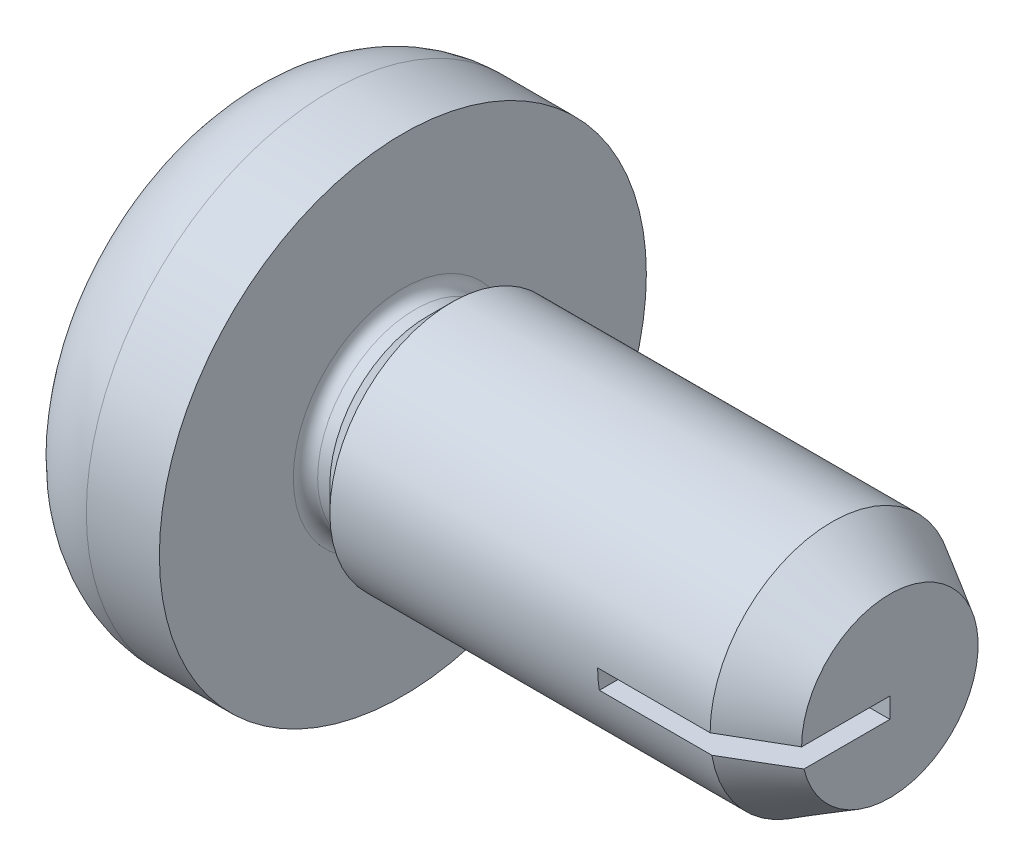
ISO-10303-21;
HEADER;
FILE_DESCRIPTION(('STEP AP214'),'2;1');
FILE_NAME('part.step','',(''),(''),'','','');
FILE_SCHEMA(('AUTOMOTIVE_DESIGN { 1 0 10303 214 1 1 1 1 }'));
ENDSEC;
DATA;
#1=APPLICATION_CONTEXT('core data for automotive mechanical design processes');
#2=APPLICATION_PROTOCOL_DEFINITION('international standard','automotive_design',2000,#1);
#3=PRODUCT_CONTEXT('',#1,'mechanical');
#4=PRODUCT('Part','Part','',(#3));
#5=PRODUCT_RELATED_PRODUCT_CATEGORY('part','',(#4));
#6=PRODUCT_DEFINITION_FORMATION('','',#4);
#7=PRODUCT_DEFINITION_CONTEXT('part definition',#1,'design');
#8=PRODUCT_DEFINITION('design','',#6,#7);
#9=PRODUCT_DEFINITION_SHAPE('','',#8);
#10=(LENGTH_UNIT() NAMED_UNIT(*) SI_UNIT(.MILLI.,.METRE.));
#11=(NAMED_UNIT(*) PLANE_ANGLE_UNIT() SI_UNIT($,.RADIAN.));
#12=(NAMED_UNIT(*) SI_UNIT($,.STERADIAN.) SOLID_ANGLE_UNIT());
#13=UNCERTAINTY_MEASURE_WITH_UNIT(LENGTH_MEASURE(1.E-05),#10,'distance_accuracy_value','');
#14=(GEOMETRIC_REPRESENTATION_CONTEXT(3) GLOBAL_UNCERTAINTY_ASSIGNED_CONTEXT((#13)) GLOBAL_UNIT_ASSIGNED_CONTEXT((#10,
#11,#12)) REPRESENTATION_CONTEXT('',''));
#15=CARTESIAN_POINT('',(0.,0.,0.));
#16=DIRECTION('',(0.,0.,1.));
#17=DIRECTION('',(1.,0.,0.));
#18=AXIS2_PLACEMENT_3D('',#15,#16,#17);
#19=CARTESIAN_POINT('',(0.,0.,0.));
#20=DIRECTION('',(-1.,0.,0.));
#21=DIRECTION('',(0.,0.,1.));
#22=AXIS2_PLACEMENT_3D('',#19,#20,#21);
#23=CYLINDRICAL_SURFACE('',#22,1.);
#24=CARTESIAN_POINT('',(1.8,0.,0.));
#25=DIRECTION('',(-1.,0.,0.));
#26=DIRECTION('',(0.,0.,1.));
#27=AXIS2_PLACEMENT_3D('',#24,#25,#26);
#28=CIRCLE('',#27,1.);
#29=CARTESIAN_POINT('',(1.8,0.,1.));
#30=VERTEX_POINT('',#29);
#31=EDGE_CURVE('E239',#30,#30,#28,.T.);
#32=ORIENTED_EDGE('',*,*,#31,.F.);
#33=EDGE_LOOP('',(#32));
#34=FACE_BOUND('',#33,.T.);
#35=DIRECTION('',(-1.,0.,0.));
#36=VECTOR('',#35,1.);
#37=CARTESIAN_POINT('',(0.,0.,1.));
#38=LINE('',#37,#36);
#39=CARTESIAN_POINT('',(4.92368602791855,0.,1.));
#40=VERTEX_POINT('',#39);
#41=CARTESIAN_POINT('',(4.,0.,1.));
#42=VERTEX_POINT('',#41);
#43=EDGE_CURVE('E385',#40,#42,#38,.T.);
#44=ORIENTED_EDGE('',*,*,#43,.F.);
#45=CARTESIAN_POINT('',(4.92368602791855,0.,0.));
#46=DIRECTION('',(-1.,0.,0.));
#47=DIRECTION('',(0.,0.,1.));
#48=AXIS2_PLACEMENT_3D('',#45,#46,#47);
#49=CIRCLE('',#48,1.);
#50=CARTESIAN_POINT('',(4.92368602791855,-0.166666666667,0.986013297183214));
#51=VERTEX_POINT('',#50);
#52=EDGE_CURVE('E378',#40,#51,#49,.T.);
#53=ORIENTED_EDGE('',*,*,#52,.T.);
#54=DIRECTION('',(-1.,0.,0.));
#55=VECTOR('',#54,1.);
#56=CARTESIAN_POINT('',(0.,-0.166666666667,0.986013297183214));
#57=LINE('',#56,#55);
#58=CARTESIAN_POINT('',(4.,-0.166666666667,0.986013297183214));
#59=VERTEX_POINT('',#58);
#60=EDGE_CURVE('E388',#59,#51,#57,.F.);
#61=ORIENTED_EDGE('',*,*,#60,.F.);
#62=CARTESIAN_POINT('',(4.,0.,0.));
#63=DIRECTION('',(1.,0.,0.));
#64=DIRECTION('',(0.,0.,-1.));
#65=AXIS2_PLACEMENT_3D('',#62,#63,#64);
#66=CIRCLE('',#65,1.);
#67=EDGE_CURVE('E47',#42,#59,#66,.T.);
#68=ORIENTED_EDGE('',*,*,#67,.F.);
#69=EDGE_LOOP('',(#44,#53,#61,#68));
#70=FACE_BOUND('',#69,.T.);
#71=ADVANCED_FACE('F77',(#34,#70),#23,.T.);
#72=CARTESIAN_POINT('',(4.92368602791855,0.,0.));
#73=DIRECTION('',(-1.,0.,0.));
#74=DIRECTION('',(0.,0.,1.));
#75=AXIS2_PLACEMENT_3D('',#72,#73,#74);
#76=CONICAL_SURFACE('',#75,1.,0.52359877559829);
#77=ORIENTED_EDGE('',*,*,#52,.F.);
#78=DIRECTION('',(-0.866025403784443,0.,0.499999999999992));
#79=VECTOR('',#78,1.);
#80=CARTESIAN_POINT('',(6.65573683548746,0.,0.));
#81=LINE('',#80,#79);
#82=CARTESIAN_POINT('',(5.4,0.,0.725));
#83=VERTEX_POINT('',#82);
#84=EDGE_CURVE('E381',#40,#83,#81,.F.);
#85=ORIENTED_EDGE('',*,*,#84,.T.);
#86=CARTESIAN_POINT('',(5.4,0.,0.));
#87=DIRECTION('',(-1.,0.,0.));
#88=DIRECTION('',(0.,0.,1.));
#89=AXIS2_PLACEMENT_3D('',#86,#87,#88);
#90=CIRCLE('',#89,0.725);
#91=CARTESIAN_POINT('',(5.4,-0.166666666667,0.705582895358236));
#92=VERTEX_POINT('',#91);
#93=EDGE_CURVE('E238',#83,#92,#90,.T.);
#94=ORIENTED_EDGE('',*,*,#93,.T.);
#95=CARTESIAN_POINT('',(6.20158381332147,-0.166666666667,0.202420053526352));
#96=CARTESIAN_POINT('',(6.18988783202895,-0.166666666667,0.211160466548466));
#97=CARTESIAN_POINT('',(6.17809025351927,-0.166666666667,0.219762178615457));
#98=CARTESIAN_POINT('',(6.15433894019531,-0.166666666667,0.23674439533294));
#99=CARTESIAN_POINT('',(6.14238522545193,-0.166666666667,0.245124928005154));
#100=CARTESIAN_POINT('',(6.10636354341478,-0.166666666667,0.270017020748473));
#101=CARTESIAN_POINT('',(6.08212753980984,-0.166666666667,0.286284562967283));
#102=CARTESIAN_POINT('',(6.03340179258785,-0.166666666667,0.318405310598077));
#103=CARTESIAN_POINT('',(6.00891218022297,-0.166666666667,0.334258716708459));
#104=CARTESIAN_POINT('',(5.9597551974987,-0.166666666667,0.365692570195686));
#105=CARTESIAN_POINT('',(5.93508780915894,-0.166666666667,0.381272989399785));
#106=CARTESIAN_POINT('',(5.8639391094644,-0.166666666667,0.425830715171695));
#107=CARTESIAN_POINT('',(5.8173079174777,-0.166666666667,0.454568202997955));
#108=CARTESIAN_POINT('',(5.72381363437526,-0.166666666667,0.511663876308473));
#109=CARTESIAN_POINT('',(5.67695053810772,-0.166666666667,0.540022053313979));
#110=CARTESIAN_POINT('',(5.53610967036872,-0.166666666667,0.624768530387752));
#111=CARTESIAN_POINT('',(5.44192005634863,-0.166666666667,0.680804321809112));
#112=CARTESIAN_POINT('',(5.20311464815555,-0.166666666667,0.822157213235166));
#113=CARTESIAN_POINT('',(5.05833205523257,-0.166666666667,0.907191272129389));
#114=CARTESIAN_POINT('',(4.84103887444817,-0.166666666667,1.03439645779865));
#115=CARTESIAN_POINT('',(4.76861884543351,-0.166666666667,1.07672255711243));
#116=CARTESIAN_POINT('',(4.6237330605002,-0.166666666667,1.16129606629584));
#117=CARTESIAN_POINT('',(4.55126730468172,-0.166666666667,1.20354347633707));
#118=CARTESIAN_POINT('',(4.47878578161587,-0.166666666667,1.24576382962673));
#119=B_SPLINE_CURVE_WITH_KNOTS('',3,(#95,#96,#97,#98,#99,#100,#101,#102,#103,#104,#105,#106,
#107,#108,#109,#110,#111,#112,#113,#114,#115,#116,#117,#118),.UNSPECIFIED.,.F.,.F.,(4,2,2,2,2,2,
2,2,2,2,2,4),(0.,0.0437997583052463,0.0875939406187874,0.175154441441534,0.262671690481174,
0.350197918883599,0.51451942003153,0.678844588147948,1.00763489196677,1.51135489439916,
1.76300032919034,2.0146452145474),.UNSPECIFIED.);
#120=EDGE_CURVE('E386',#92,#51,#119,.T.);
#121=ORIENTED_EDGE('',*,*,#120,.T.);
#122=EDGE_LOOP('',(#77,#85,#94,#121));
#123=FACE_BOUND('',#122,.T.);
#124=ADVANCED_FACE('F400',(#123),#76,.T.);
#125=CARTESIAN_POINT('',(5.4,1.,0.));
#126=DIRECTION('',(-1.,0.,0.));
#127=DIRECTION('',(0.,0.,1.));
#128=AXIS2_PLACEMENT_3D('',#125,#126,#127);
#129=PLANE('',#128);
#130=DIRECTION('',(0.,0.,1.));
#131=VECTOR('',#130,1.);
#132=CARTESIAN_POINT('',(5.4,0.,0.));
#133=LINE('',#132,#131);
#134=CARTESIAN_POINT('',(5.4,0.,0.));
#135=VERTEX_POINT('',#134);
#136=EDGE_CURVE('E82',#135,#83,#133,.T.);
#137=ORIENTED_EDGE('',*,*,#136,.F.);
#138=DIRECTION('',(0.,1.,0.));
#139=VECTOR('',#138,1.);
#140=CARTESIAN_POINT('',(5.4,0.,0.));
#141=LINE('',#140,#139);
#142=CARTESIAN_POINT('',(5.4,-0.166666666667,0.));
#143=VERTEX_POINT('',#142);
#144=EDGE_CURVE('E226',#143,#135,#141,.T.);
#145=ORIENTED_EDGE('',*,*,#144,.F.);
#146=DIRECTION('',(0.,0.,-1.));
#147=VECTOR('',#146,1.);
#148=CARTESIAN_POINT('',(5.4,-0.166666666667,0.));
#149=LINE('',#148,#147);
#150=EDGE_CURVE('E237',#92,#143,#149,.T.);
#151=ORIENTED_EDGE('',*,*,#150,.F.);
#152=ORIENTED_EDGE('',*,*,#93,.F.);
#153=EDGE_LOOP('',(#137,#145,#151,#152));
#154=FACE_BOUND('',#153,.T.);
#155=ADVANCED_FACE('F236',(#154),#129,.F.);
#156=CARTESIAN_POINT('',(0.,0.,0.));
#157=DIRECTION('',(1.,0.,0.));
#158=DIRECTION('',(0.,0.,-1.));
#159=AXIS2_PLACEMENT_3D('',#156,#157,#158);
#160=PLANE('',#159);
#161=CARTESIAN_POINT('',(0.,0.,0.));
#162=DIRECTION('',(-1.,0.,0.));
#163=DIRECTION('',(0.,0.,1.));
#164=AXIS2_PLACEMENT_3D('',#161,#162,#163);
#165=CIRCLE('',#164,1.2);
#166=CARTESIAN_POINT('',(0.,0.,1.2));
#167=VERTEX_POINT('',#166);
#168=EDGE_CURVE('E267',#167,#167,#165,.T.);
#169=ORIENTED_EDGE('',*,*,#168,.T.);
#170=EDGE_LOOP('',(#169));
#171=FACE_BOUND('',#170,.T.);
#172=DIRECTION('',(0.,0.,-1.));
#173=VECTOR('',#172,1.);
#174=CARTESIAN_POINT('',(0.,-0.265,0.264999999999999));
#175=LINE('',#174,#173);
#176=CARTESIAN_POINT('',(0.,-0.265,1.07));
#177=VERTEX_POINT('',#176);
#178=CARTESIAN_POINT('',(0.,-0.265,0.478999999999999));
#179=VERTEX_POINT('',#178);
#180=EDGE_CURVE('E314',#177,#179,#175,.T.);
#181=ORIENTED_EDGE('',*,*,#180,.T.);
#182=DIRECTION('',(0.,0.707106781186549,0.707106781186546));
#183=VECTOR('',#182,1.);
#184=CARTESIAN_POINT('',(0.,-0.479,0.265));
#185=LINE('',#184,#183);
#186=CARTESIAN_POINT('',(0.,-0.479,0.265));
#187=VERTEX_POINT('',#186);
#188=EDGE_CURVE('E372',#187,#179,#185,.T.);
#189=ORIENTED_EDGE('',*,*,#188,.F.);
#190=DIRECTION('',(0.,-1.,0.));
#191=VECTOR('',#190,1.);
#192=CARTESIAN_POINT('',(0.,-0.265,0.264999999999999));
#193=LINE('',#192,#191);
#194=CARTESIAN_POINT('',(0.,-1.07,0.265));
#195=VERTEX_POINT('',#194);
#196=EDGE_CURVE('E312',#187,#195,#193,.T.);
#197=ORIENTED_EDGE('',*,*,#196,.T.);
#198=DIRECTION('',(0.,0.,-1.));
#199=VECTOR('',#198,1.);
#200=CARTESIAN_POINT('',(0.,-1.07,-0.265));
#201=LINE('',#200,#199);
#202=CARTESIAN_POINT('',(0.,-1.07,-0.265));
#203=VERTEX_POINT('',#202);
#204=EDGE_CURVE('E309',#195,#203,#201,.T.);
#205=ORIENTED_EDGE('',*,*,#204,.T.);
#206=DIRECTION('',(0.,1.,0.));
#207=VECTOR('',#206,1.);
#208=CARTESIAN_POINT('',(0.,-0.265,-0.265));
#209=LINE('',#208,#207);
#210=CARTESIAN_POINT('',(0.,-0.479,-0.265));
#211=VERTEX_POINT('',#210);
#212=EDGE_CURVE('E310',#203,#211,#209,.T.);
#213=ORIENTED_EDGE('',*,*,#212,.T.);
#214=DIRECTION('',(0.,-0.707106781186548,0.707106781186547));
#215=VECTOR('',#214,1.);
#216=CARTESIAN_POINT('',(0.,-0.479,-0.265));
#217=LINE('',#216,#215);
#218=CARTESIAN_POINT('',(0.,-0.265,-0.478999999999999));
#219=VERTEX_POINT('',#218);
#220=EDGE_CURVE('E362',#219,#211,#217,.T.);
#221=ORIENTED_EDGE('',*,*,#220,.F.);
#222=DIRECTION('',(0.,0.,-1.));
#223=VECTOR('',#222,1.);
#224=CARTESIAN_POINT('',(0.,-0.265,-1.07));
#225=LINE('',#224,#223);
#226=CARTESIAN_POINT('',(0.,-0.265,-1.07));
#227=VERTEX_POINT('',#226);
#228=EDGE_CURVE('E304',#219,#227,#225,.T.);
#229=ORIENTED_EDGE('',*,*,#228,.T.);
#230=DIRECTION('',(0.,1.,0.));
#231=VECTOR('',#230,1.);
#232=CARTESIAN_POINT('',(0.,0.265,-1.07));
#233=LINE('',#232,#231);
#234=CARTESIAN_POINT('',(0.,0.265,-1.07));
#235=VERTEX_POINT('',#234);
#236=EDGE_CURVE('E305',#227,#235,#233,.T.);
#237=ORIENTED_EDGE('',*,*,#236,.T.);
#238=DIRECTION('',(0.,0.,1.));
#239=VECTOR('',#238,1.);
#240=CARTESIAN_POINT('',(0.,0.265,-1.07));
#241=LINE('',#240,#239);
#242=CARTESIAN_POINT('',(0.,0.265,-0.478999999999999));
#243=VERTEX_POINT('',#242);
#244=EDGE_CURVE('E299',#235,#243,#241,.T.);
#245=ORIENTED_EDGE('',*,*,#244,.T.);
#246=DIRECTION('',(0.,-0.707106781186548,-0.707106781186547));
#247=VECTOR('',#246,1.);
#248=CARTESIAN_POINT('',(0.,0.479,-0.265));
#249=LINE('',#248,#247);
#250=CARTESIAN_POINT('',(0.,0.479,-0.265));
#251=VERTEX_POINT('',#250);
#252=EDGE_CURVE('E357',#251,#243,#249,.T.);
#253=ORIENTED_EDGE('',*,*,#252,.F.);
#254=DIRECTION('',(0.,1.,0.));
#255=VECTOR('',#254,1.);
#256=CARTESIAN_POINT('',(0.,1.07,-0.265));
#257=LINE('',#256,#255);
#258=CARTESIAN_POINT('',(0.,1.07,-0.265));
#259=VERTEX_POINT('',#258);
#260=EDGE_CURVE('E329',#251,#259,#257,.T.);
#261=ORIENTED_EDGE('',*,*,#260,.T.);
#262=DIRECTION('',(0.,0.,1.));
#263=VECTOR('',#262,1.);
#264=CARTESIAN_POINT('',(0.,1.07,-0.265));
#265=LINE('',#264,#263);
#266=CARTESIAN_POINT('',(0.,1.07,0.265));
#267=VERTEX_POINT('',#266);
#268=EDGE_CURVE('E327',#259,#267,#265,.T.);
#269=ORIENTED_EDGE('',*,*,#268,.T.);
#270=DIRECTION('',(0.,-1.,0.));
#271=VECTOR('',#270,1.);
#272=CARTESIAN_POINT('',(0.,1.07,0.265));
#273=LINE('',#272,#271);
#274=CARTESIAN_POINT('',(0.,0.479,0.265));
#275=VERTEX_POINT('',#274);
#276=EDGE_CURVE('E321',#267,#275,#273,.T.);
#277=ORIENTED_EDGE('',*,*,#276,.T.);
#278=DIRECTION('',(0.,0.707106781186548,-0.707106781186547));
#279=VECTOR('',#278,1.);
#280=CARTESIAN_POINT('',(0.,0.479,0.265));
#281=LINE('',#280,#279);
#282=CARTESIAN_POINT('',(0.,0.265,0.478999999999999));
#283=VERTEX_POINT('',#282);
#284=EDGE_CURVE('E350',#283,#275,#281,.T.);
#285=ORIENTED_EDGE('',*,*,#284,.F.);
#286=DIRECTION('',(0.,0.,1.));
#287=VECTOR('',#286,1.);
#288=CARTESIAN_POINT('',(0.,0.265,0.264999999999999));
#289=LINE('',#288,#287);
#290=CARTESIAN_POINT('',(0.,0.265,1.07));
#291=VERTEX_POINT('',#290);
#292=EDGE_CURVE('E323',#283,#291,#289,.T.);
#293=ORIENTED_EDGE('',*,*,#292,.T.);
#294=DIRECTION('',(0.,-1.,0.));
#295=VECTOR('',#294,1.);
#296=CARTESIAN_POINT('',(0.,0.265,1.07));
#297=LINE('',#296,#295);
#298=EDGE_CURVE('E319',#291,#177,#297,.T.);
#299=ORIENTED_EDGE('',*,*,#298,.T.);
#300=EDGE_LOOP('',(#181,#189,#197,#205,#213,#221,#229,#237,#245,#253,#261,#269,#277,#285,#293,#299));
#301=FACE_BOUND('',#300,.T.);
#302=ADVANCED_FACE('F431',(#171,#301),#160,.F.);
#303=CARTESIAN_POINT('',(1.8,0.,0.));
#304=DIRECTION('',(1.,0.,0.));
#305=DIRECTION('',(0.,0.,-1.));
#306=AXIS2_PLACEMENT_3D('',#303,#304,#305);
#307=CONICAL_SURFACE('',#306,1.,0.785398163397449);
#308=CARTESIAN_POINT('',(1.6,0.,0.));
#309=DIRECTION('',(-1.,0.,0.));
#310=DIRECTION('',(0.,0.,1.));
#311=AXIS2_PLACEMENT_3D('',#308,#309,#310);
#312=CIRCLE('',#311,0.800000000000001);
#313=CARTESIAN_POINT('',(1.6,0.,0.800000000000001));
#314=VERTEX_POINT('',#313);
#315=EDGE_CURVE('E285',#314,#314,#312,.T.);
#316=ORIENTED_EDGE('',*,*,#315,.F.);
#317=EDGE_LOOP('',(#316));
#318=FACE_BOUND('',#317,.T.);
#319=ORIENTED_EDGE('',*,*,#31,.T.);
#320=EDGE_LOOP('',(#319));
#321=FACE_BOUND('',#320,.T.);
#322=ADVANCED_FACE('F430',(#318,#321),#307,.T.);
#323=CARTESIAN_POINT('',(0.,0.,0.));
#324=DIRECTION('',(-1.,0.,0.));
#325=DIRECTION('',(0.,0.,1.));
#326=AXIS2_PLACEMENT_3D('',#323,#324,#325);
#327=CYLINDRICAL_SURFACE('',#326,0.800000000000001);
#328=CARTESIAN_POINT('',(1.5,0.,0.));
#329=DIRECTION('',(-1.,0.,0.));
#330=DIRECTION('',(0.,0.,1.));
#331=AXIS2_PLACEMENT_3D('',#328,#329,#330);
#332=CIRCLE('',#331,0.800000000000001);
#333=CARTESIAN_POINT('',(1.5,0.,0.800000000000001));
#334=VERTEX_POINT('',#333);
#335=EDGE_CURVE('E281',#334,#334,#332,.T.);
#336=ORIENTED_EDGE('',*,*,#335,.F.);
#337=EDGE_LOOP('',(#336));
#338=FACE_BOUND('',#337,.T.);
#339=ORIENTED_EDGE('',*,*,#315,.T.);
#340=EDGE_LOOP('',(#339));
#341=FACE_BOUND('',#340,.T.);
#342=ADVANCED_FACE('F554',(#338,#341),#327,.T.);
#343=CARTESIAN_POINT('',(1.5,0.,0.));
#344=DIRECTION('',(-1.,0.,0.));
#345=DIRECTION('',(0.,0.,1.));
#346=AXIS2_PLACEMENT_3D('',#343,#344,#345);
#347=TOROIDAL_SURFACE('',#346,0.900000000000001,0.1);
#348=CARTESIAN_POINT('',(1.4,0.,0.));
#349=DIRECTION('',(-1.,0.,0.));
#350=DIRECTION('',(0.,0.,1.));
#351=AXIS2_PLACEMENT_3D('',#348,#349,#350);
#352=CIRCLE('',#351,0.900000000000001);
#353=CARTESIAN_POINT('',(1.4,0.,0.900000000000001));
#354=VERTEX_POINT('',#353);
#355=EDGE_CURVE('E290',#354,#354,#352,.T.);
#356=ORIENTED_EDGE('',*,*,#355,.F.);
#357=EDGE_LOOP('',(#356));
#358=FACE_BOUND('',#357,.T.);
#359=ORIENTED_EDGE('',*,*,#335,.T.);
#360=EDGE_LOOP('',(#359));
#361=FACE_BOUND('',#360,.T.);
#362=ADVANCED_FACE('F552',(#358,#361),#347,.F.);
#363=CARTESIAN_POINT('',(1.4,2.,0.));
#364=DIRECTION('',(-1.,0.,0.));
#365=DIRECTION('',(0.,0.,1.));
#366=AXIS2_PLACEMENT_3D('',#363,#364,#365);
#367=PLANE('',#366);
#368=CARTESIAN_POINT('',(1.4,0.,0.));
#369=DIRECTION('',(-1.,0.,0.));
#370=DIRECTION('',(0.,0.,1.));
#371=AXIS2_PLACEMENT_3D('',#368,#369,#370);
#372=CIRCLE('',#371,2.);
#373=CARTESIAN_POINT('',(1.4,0.,2.));
#374=VERTEX_POINT('',#373);
#375=EDGE_CURVE('E293',#374,#374,#372,.T.);
#376=ORIENTED_EDGE('',*,*,#375,.F.);
#377=EDGE_LOOP('',(#376));
#378=FACE_BOUND('',#377,.T.);
#379=ORIENTED_EDGE('',*,*,#355,.T.);
#380=EDGE_LOOP('',(#379));
#381=FACE_BOUND('',#380,.T.);
#382=ADVANCED_FACE('F550',(#378,#381),#367,.F.);
#383=CARTESIAN_POINT('',(0.,0.,0.));
#384=DIRECTION('',(-1.,0.,0.));
#385=DIRECTION('',(0.,0.,1.));
#386=AXIS2_PLACEMENT_3D('',#383,#384,#385);
#387=CYLINDRICAL_SURFACE('',#386,2.);
#388=CARTESIAN_POINT('',(0.8,0.,0.));
#389=DIRECTION('',(-1.,0.,0.));
#390=DIRECTION('',(0.,0.,1.));
#391=AXIS2_PLACEMENT_3D('',#388,#389,#390);
#392=CIRCLE('',#391,2.);
#393=CARTESIAN_POINT('',(0.8,0.,2.));
#394=VERTEX_POINT('',#393);
#395=EDGE_CURVE('E295',#394,#394,#392,.T.);
#396=ORIENTED_EDGE('',*,*,#395,.F.);
#397=EDGE_LOOP('',(#396));
#398=FACE_BOUND('',#397,.T.);
#399=ORIENTED_EDGE('',*,*,#375,.T.);
#400=EDGE_LOOP('',(#399));
#401=FACE_BOUND('',#400,.T.);
#402=ADVANCED_FACE('F544',(#398,#401),#387,.T.);
#403=CARTESIAN_POINT('',(0.8,0.,0.));
#404=DIRECTION('',(-1.,0.,0.));
#405=DIRECTION('',(0.,0.,1.));
#406=AXIS2_PLACEMENT_3D('',#403,#404,#405);
#407=TOROIDAL_SURFACE('',#406,1.2,0.8);
#408=ORIENTED_EDGE('',*,*,#168,.F.);
#409=EDGE_LOOP('',(#408));
#410=FACE_BOUND('',#409,.T.);
#411=ORIENTED_EDGE('',*,*,#395,.T.);
#412=EDGE_LOOP('',(#411));
#413=FACE_BOUND('',#412,.T.);
#414=ADVANCED_FACE('F536',(#410,#413),#407,.T.);
#415=CARTESIAN_POINT('',(0.95,1.07,-0.265));
#416=DIRECTION('',(0.,0.,1.));
#417=DIRECTION('',(1.,0.,0.));
#418=AXIS2_PLACEMENT_3D('',#415,#416,#417);
#419=PLANE('',#418);
#420=DIRECTION('',(-1.,0.,0.));
#421=VECTOR('',#420,1.);
#422=CARTESIAN_POINT('',(1.25264170234784,0.479,-0.265));
#423=LINE('',#422,#421);
#424=CARTESIAN_POINT('',(0.95,0.479,-0.265));
#425=VERTEX_POINT('',#424);
#426=EDGE_CURVE('E353',#425,#251,#423,.T.);
#427=ORIENTED_EDGE('',*,*,#426,.F.);
#428=DIRECTION('',(0.,1.,0.));
#429=VECTOR('',#428,1.);
#430=CARTESIAN_POINT('',(0.95,1.07,-0.265));
#431=LINE('',#430,#429);
#432=CARTESIAN_POINT('',(0.95,0.724228277447107,-0.265));
#433=VERTEX_POINT('',#432);
#434=EDGE_CURVE('E268',#425,#433,#431,.T.);
#435=ORIENTED_EDGE('',*,*,#434,.T.);
#436=DIRECTION('',(-0.939692620785908,0.342020143325669,0.));
#437=VECTOR('',#436,1.);
#438=CARTESIAN_POINT('',(0.,1.07,-0.265));
#439=LINE('',#438,#437);
#440=EDGE_CURVE('E263',#433,#259,#439,.T.);
#441=ORIENTED_EDGE('',*,*,#440,.T.);
#442=ORIENTED_EDGE('',*,*,#260,.F.);
#443=EDGE_LOOP('',(#427,#435,#441,#442));
#444=FACE_BOUND('',#443,.T.);
#445=ADVANCED_FACE('F504',(#444),#419,.T.);
#446=CARTESIAN_POINT('',(0.,1.07,-0.265));
#447=DIRECTION('',(-0.342020143325669,-0.939692620785908,0.));
#448=DIRECTION('',(0.939692620785908,-0.342020143325669,0.));
#449=AXIS2_PLACEMENT_3D('',#446,#447,#448);
#450=PLANE('',#449);
#451=ORIENTED_EDGE('',*,*,#268,.F.);
#452=ORIENTED_EDGE('',*,*,#440,.F.);
#453=DIRECTION('',(0.,0.,1.));
#454=VECTOR('',#453,1.);
#455=CARTESIAN_POINT('',(0.95,0.724228277447107,-0.265));
#456=LINE('',#455,#454);
#457=CARTESIAN_POINT('',(0.95,0.724228277447107,0.265));
#458=VERTEX_POINT('',#457);
#459=EDGE_CURVE('E269',#433,#458,#456,.T.);
#460=ORIENTED_EDGE('',*,*,#459,.T.);
#461=DIRECTION('',(-0.939692620785908,0.342020143325669,0.));
#462=VECTOR('',#461,1.);
#463=CARTESIAN_POINT('',(0.838871110481514,0.764675885398893,0.265));
#464=LINE('',#463,#462);
#465=EDGE_CURVE('E260',#458,#267,#464,.T.);
#466=ORIENTED_EDGE('',*,*,#465,.T.);
#467=EDGE_LOOP('',(#451,#452,#460,#466));
#468=FACE_BOUND('',#467,.T.);
#469=ADVANCED_FACE('F76',(#468),#450,.T.);
#470=CARTESIAN_POINT('',(0.95,1.07,0.265));
#471=DIRECTION('',(0.,0.,-1.));
#472=DIRECTION('',(0.,1.,0.));
#473=AXIS2_PLACEMENT_3D('',#470,#471,#472);
#474=PLANE('',#473);
#475=DIRECTION('',(-1.,0.,0.));
#476=VECTOR('',#475,1.);
#477=CARTESIAN_POINT('',(1.25264170234784,0.479,0.265));
#478=LINE('',#477,#476);
#479=CARTESIAN_POINT('',(0.95,0.479,0.265));
#480=VERTEX_POINT('',#479);
#481=EDGE_CURVE('E347',#480,#275,#478,.T.);
#482=ORIENTED_EDGE('',*,*,#481,.T.);
#483=ORIENTED_EDGE('',*,*,#276,.F.);
#484=ORIENTED_EDGE('',*,*,#465,.F.);
#485=DIRECTION('',(0.,-1.,0.));
#486=VECTOR('',#485,1.);
#487=CARTESIAN_POINT('',(0.95,1.07,0.265));
#488=LINE('',#487,#486);
#489=EDGE_CURVE('E266',#458,#480,#488,.T.);
#490=ORIENTED_EDGE('',*,*,#489,.T.);
#491=EDGE_LOOP('',(#482,#483,#484,#490));
#492=FACE_BOUND('',#491,.T.);
#493=ADVANCED_FACE('F454',(#492),#474,.T.);
#494=CARTESIAN_POINT('',(0.95,0.265,0.264999999999999));
#495=DIRECTION('',(0.,-1.,0.));
#496=DIRECTION('',(0.,0.,-1.));
#497=AXIS2_PLACEMENT_3D('',#494,#495,#496);
#498=PLANE('',#497);
#499=DIRECTION('',(-1.,0.,0.));
#500=VECTOR('',#499,1.);
#501=CARTESIAN_POINT('',(1.25264170234784,0.265,0.478999999999999));
#502=LINE('',#501,#500);
#503=CARTESIAN_POINT('',(0.95,0.265,0.478999999999999));
#504=VERTEX_POINT('',#503);
#505=EDGE_CURVE('E342',#504,#283,#502,.T.);
#506=ORIENTED_EDGE('',*,*,#505,.F.);
#507=DIRECTION('',(0.,0.,1.));
#508=VECTOR('',#507,1.);
#509=CARTESIAN_POINT('',(0.95,0.265,0.264999999999999));
#510=LINE('',#509,#508);
#511=CARTESIAN_POINT('',(0.95,0.265,0.724228277447107));
#512=VERTEX_POINT('',#511);
#513=EDGE_CURVE('E262',#504,#512,#510,.T.);
#514=ORIENTED_EDGE('',*,*,#513,.T.);
#515=DIRECTION('',(-0.939692620785908,0.,0.342020143325669));
#516=VECTOR('',#515,1.);
#517=CARTESIAN_POINT('',(0.,0.265,1.07));
#518=LINE('',#517,#516);
#519=EDGE_CURVE('E251',#512,#291,#518,.T.);
#520=ORIENTED_EDGE('',*,*,#519,.T.);
#521=ORIENTED_EDGE('',*,*,#292,.F.);
#522=EDGE_LOOP('',(#506,#514,#520,#521));
#523=FACE_BOUND('',#522,.T.);
#524=ADVANCED_FACE('F447',(#523),#498,.T.);
#525=CARTESIAN_POINT('',(0.,0.265,1.07));
#526=DIRECTION('',(-0.342020143325669,0.,-0.939692620785908));
#527=DIRECTION('',(-0.939692620785908,0.,0.342020143325669));
#528=AXIS2_PLACEMENT_3D('',#525,#526,#527);
#529=PLANE('',#528);
#530=ORIENTED_EDGE('',*,*,#298,.F.);
#531=ORIENTED_EDGE('',*,*,#519,.F.);
#532=DIRECTION('',(0.,-1.,0.));
#533=VECTOR('',#532,1.);
#534=CARTESIAN_POINT('',(0.95,0.265,0.724228277447107));
#535=LINE('',#534,#533);
#536=CARTESIAN_POINT('',(0.95,-0.265,0.724228277447107));
#537=VERTEX_POINT('',#536);
#538=EDGE_CURVE('E256',#512,#537,#535,.T.);
#539=ORIENTED_EDGE('',*,*,#538,.T.);
#540=DIRECTION('',(-0.939692620785908,0.,0.342020143325669));
#541=VECTOR('',#540,1.);
#542=CARTESIAN_POINT('',(1.09759312338035,-0.265,0.670508773754281));
#543=LINE('',#542,#541);
#544=EDGE_CURVE('E246',#537,#177,#543,.T.);
#545=ORIENTED_EDGE('',*,*,#544,.T.);
#546=EDGE_LOOP('',(#530,#531,#539,#545));
#547=FACE_BOUND('',#546,.T.);
#548=ADVANCED_FACE('F442',(#547),#529,.T.);
#549=CARTESIAN_POINT('',(0.95,-0.265,0.264999999999999));
#550=DIRECTION('',(0.,1.,0.));
#551=DIRECTION('',(0.,0.,1.));
#552=AXIS2_PLACEMENT_3D('',#549,#550,#551);
#553=PLANE('',#552);
#554=DIRECTION('',(-1.,0.,0.));
#555=VECTOR('',#554,1.);
#556=CARTESIAN_POINT('',(1.25264170234784,-0.265,0.478999999999999));
#557=LINE('',#556,#555);
#558=CARTESIAN_POINT('',(0.95,-0.265,0.478999999999999));
#559=VERTEX_POINT('',#558);
#560=EDGE_CURVE('E371',#559,#179,#557,.T.);
#561=ORIENTED_EDGE('',*,*,#560,.T.);
#562=ORIENTED_EDGE('',*,*,#180,.F.);
#563=ORIENTED_EDGE('',*,*,#544,.F.);
#564=DIRECTION('',(0.,0.,-1.));
#565=VECTOR('',#564,1.);
#566=CARTESIAN_POINT('',(0.95,-0.265,0.264999999999999));
#567=LINE('',#566,#565);
#568=EDGE_CURVE('E259',#537,#559,#567,.T.);
#569=ORIENTED_EDGE('',*,*,#568,.T.);
#570=EDGE_LOOP('',(#561,#562,#563,#569));
#571=FACE_BOUND('',#570,.T.);
#572=ADVANCED_FACE('F444',(#571),#553,.T.);
#573=CARTESIAN_POINT('',(0.95,-0.265,0.264999999999999));
#574=DIRECTION('',(0.,0.,-1.));
#575=DIRECTION('',(0.,1.,0.));
#576=AXIS2_PLACEMENT_3D('',#573,#574,#575);
#577=PLANE('',#576);
#578=DIRECTION('',(-1.,0.,0.));
#579=VECTOR('',#578,1.);
#580=CARTESIAN_POINT('',(1.25264170234784,-0.479,0.265));
#581=LINE('',#580,#579);
#582=CARTESIAN_POINT('',(0.95,-0.479,0.265));
#583=VERTEX_POINT('',#582);
#584=EDGE_CURVE('E375',#583,#187,#581,.T.);
#585=ORIENTED_EDGE('',*,*,#584,.F.);
#586=DIRECTION('',(0.,-1.,0.));
#587=VECTOR('',#586,1.);
#588=CARTESIAN_POINT('',(0.95,-0.265,0.264999999999999));
#589=LINE('',#588,#587);
#590=CARTESIAN_POINT('',(0.95,-0.724228277447107,0.264999999999999));
#591=VERTEX_POINT('',#590);
#592=EDGE_CURVE('E252',#583,#591,#589,.T.);
#593=ORIENTED_EDGE('',*,*,#592,.T.);
#594=DIRECTION('',(-0.939692620785908,-0.342020143325669,0.));
#595=VECTOR('',#594,1.);
#596=CARTESIAN_POINT('',(0.,-1.07,0.265));
#597=LINE('',#596,#595);
#598=EDGE_CURVE('E243',#591,#195,#597,.T.);
#599=ORIENTED_EDGE('',*,*,#598,.T.);
#600=ORIENTED_EDGE('',*,*,#196,.F.);
#601=EDGE_LOOP('',(#585,#593,#599,#600));
#602=FACE_BOUND('',#601,.T.);
#603=ADVANCED_FACE('F441',(#602),#577,.T.);
#604=CARTESIAN_POINT('',(0.,-1.07,-0.265));
#605=DIRECTION('',(-0.342020143325669,0.939692620785908,0.));
#606=DIRECTION('',(-0.939692620785908,-0.342020143325669,0.));
#607=AXIS2_PLACEMENT_3D('',#604,#605,#606);
#608=PLANE('',#607);
#609=ORIENTED_EDGE('',*,*,#204,.F.);
#610=ORIENTED_EDGE('',*,*,#598,.F.);
#611=DIRECTION('',(0.,0.,-1.));
#612=VECTOR('',#611,1.);
#613=CARTESIAN_POINT('',(0.95,-0.724228277447107,-0.265));
#614=LINE('',#613,#612);
#615=CARTESIAN_POINT('',(0.95,-0.724228277447107,-0.265));
#616=VERTEX_POINT('',#615);
#617=EDGE_CURVE('E247',#591,#616,#614,.T.);
#618=ORIENTED_EDGE('',*,*,#617,.T.);
#619=DIRECTION('',(-0.939692620785908,-0.342020143325669,0.));
#620=VECTOR('',#619,1.);
#621=CARTESIAN_POINT('',(1.09759312338035,-0.670508773754281,-0.265));
#622=LINE('',#621,#620);
#623=EDGE_CURVE('E250',#616,#203,#622,.T.);
#624=ORIENTED_EDGE('',*,*,#623,.T.);
#625=EDGE_LOOP('',(#609,#610,#618,#624));
#626=FACE_BOUND('',#625,.T.);
#627=ADVANCED_FACE('F438',(#626),#608,.T.);
#628=CARTESIAN_POINT('',(0.95,-0.265,-0.265));
#629=DIRECTION('',(0.,0.,1.));
#630=DIRECTION('',(1.,0.,0.));
#631=AXIS2_PLACEMENT_3D('',#628,#629,#630);
#632=PLANE('',#631);
#633=DIRECTION('',(-1.,0.,0.));
#634=VECTOR('',#633,1.);
#635=CARTESIAN_POINT('',(1.25264170234784,-0.479,-0.265));
#636=LINE('',#635,#634);
#637=CARTESIAN_POINT('',(0.95,-0.479,-0.265));
#638=VERTEX_POINT('',#637);
#639=EDGE_CURVE('E364',#638,#211,#636,.T.);
#640=ORIENTED_EDGE('',*,*,#639,.T.);
#641=ORIENTED_EDGE('',*,*,#212,.F.);
#642=ORIENTED_EDGE('',*,*,#623,.F.);
#643=DIRECTION('',(0.,1.,0.));
#644=VECTOR('',#643,1.);
#645=CARTESIAN_POINT('',(0.95,-0.265,-0.265));
#646=LINE('',#645,#644);
#647=EDGE_CURVE('E249',#616,#638,#646,.T.);
#648=ORIENTED_EDGE('',*,*,#647,.T.);
#649=EDGE_LOOP('',(#640,#641,#642,#648));
#650=FACE_BOUND('',#649,.T.);
#651=ADVANCED_FACE('F439',(#650),#632,.T.);
#652=CARTESIAN_POINT('',(0.95,-0.265,-1.07));
#653=DIRECTION('',(0.,1.,0.));
#654=DIRECTION('',(0.,0.,1.));
#655=AXIS2_PLACEMENT_3D('',#652,#653,#654);
#656=PLANE('',#655);
#657=DIRECTION('',(-1.,0.,0.));
#658=VECTOR('',#657,1.);
#659=CARTESIAN_POINT('',(1.25264170234784,-0.265,-0.478999999999999));
#660=LINE('',#659,#658);
#661=CARTESIAN_POINT('',(0.95,-0.265,-0.478999999999999));
#662=VERTEX_POINT('',#661);
#663=EDGE_CURVE('E365',#662,#219,#660,.T.);
#664=ORIENTED_EDGE('',*,*,#663,.F.);
#665=DIRECTION('',(0.,0.,-1.));
#666=VECTOR('',#665,1.);
#667=CARTESIAN_POINT('',(0.95,-0.265,-1.07));
#668=LINE('',#667,#666);
#669=CARTESIAN_POINT('',(0.95,-0.265,-0.724228277447107));
#670=VERTEX_POINT('',#669);
#671=EDGE_CURVE('E276',#662,#670,#668,.T.);
#672=ORIENTED_EDGE('',*,*,#671,.T.);
#673=DIRECTION('',(-0.939692620785908,0.,-0.342020143325669));
#674=VECTOR('',#673,1.);
#675=CARTESIAN_POINT('',(0.,-0.265,-1.07));
#676=LINE('',#675,#674);
#677=EDGE_CURVE('E254',#670,#227,#676,.T.);
#678=ORIENTED_EDGE('',*,*,#677,.T.);
#679=ORIENTED_EDGE('',*,*,#228,.F.);
#680=EDGE_LOOP('',(#664,#672,#678,#679));
#681=FACE_BOUND('',#680,.T.);
#682=ADVANCED_FACE('F436',(#681),#656,.T.);
#683=CARTESIAN_POINT('',(0.,0.265,-1.07));
#684=DIRECTION('',(-0.342020143325669,0.,0.939692620785908));
#685=DIRECTION('',(0.939692620785908,0.,0.342020143325669));
#686=AXIS2_PLACEMENT_3D('',#683,#684,#685);
#687=PLANE('',#686);
#688=ORIENTED_EDGE('',*,*,#236,.F.);
#689=ORIENTED_EDGE('',*,*,#677,.F.);
#690=DIRECTION('',(0.,1.,0.));
#691=VECTOR('',#690,1.);
#692=CARTESIAN_POINT('',(0.95,0.265,-0.724228277447106));
#693=LINE('',#692,#691);
#694=CARTESIAN_POINT('',(0.95,0.265,-0.724228277447106));
#695=VERTEX_POINT('',#694);
#696=EDGE_CURVE('E273',#670,#695,#693,.T.);
#697=ORIENTED_EDGE('',*,*,#696,.T.);
#698=DIRECTION('',(-0.939692620785908,0.,-0.342020143325669));
#699=VECTOR('',#698,1.);
#700=CARTESIAN_POINT('',(0.838871110481514,0.265,-0.764675885398893));
#701=LINE('',#700,#699);
#702=EDGE_CURVE('E274',#695,#235,#701,.T.);
#703=ORIENTED_EDGE('',*,*,#702,.T.);
#704=EDGE_LOOP('',(#688,#689,#697,#703));
#705=FACE_BOUND('',#704,.T.);
#706=ADVANCED_FACE('F435',(#705),#687,.T.);
#707=CARTESIAN_POINT('',(0.95,0.265,-1.07));
#708=DIRECTION('',(0.,-1.,0.));
#709=DIRECTION('',(0.,0.,-1.));
#710=AXIS2_PLACEMENT_3D('',#707,#708,#709);
#711=PLANE('',#710);
#712=DIRECTION('',(-1.,0.,0.));
#713=VECTOR('',#712,1.);
#714=CARTESIAN_POINT('',(1.25264170234784,0.265,-0.478999999999999));
#715=LINE('',#714,#713);
#716=CARTESIAN_POINT('',(0.95,0.265,-0.478999999999999));
#717=VERTEX_POINT('',#716);
#718=EDGE_CURVE('E351',#717,#243,#715,.T.);
#719=ORIENTED_EDGE('',*,*,#718,.T.);
#720=ORIENTED_EDGE('',*,*,#244,.F.);
#721=ORIENTED_EDGE('',*,*,#702,.F.);
#722=DIRECTION('',(0.,0.,1.));
#723=VECTOR('',#722,1.);
#724=CARTESIAN_POINT('',(0.95,0.265,-1.07));
#725=LINE('',#724,#723);
#726=EDGE_CURVE('E280',#695,#717,#725,.T.);
#727=ORIENTED_EDGE('',*,*,#726,.T.);
#728=EDGE_LOOP('',(#719,#720,#721,#727));
#729=FACE_BOUND('',#728,.T.);
#730=ADVANCED_FACE('F434',(#729),#711,.T.);
#731=CARTESIAN_POINT('',(0.95,0.265,-0.265));
#732=DIRECTION('',(-1.,0.,0.));
#733=DIRECTION('',(0.,0.,1.));
#734=AXIS2_PLACEMENT_3D('',#731,#732,#733);
#735=PLANE('',#734);
#736=ORIENTED_EDGE('',*,*,#592,.F.);
#737=DIRECTION('',(0.,-0.707106781186549,-0.707106781186546));
#738=VECTOR('',#737,1.);
#739=CARTESIAN_POINT('',(0.95,-0.479,0.265));
#740=LINE('',#739,#738);
#741=EDGE_CURVE('E100',#559,#583,#740,.T.);
#742=ORIENTED_EDGE('',*,*,#741,.F.);
#743=ORIENTED_EDGE('',*,*,#568,.F.);
#744=ORIENTED_EDGE('',*,*,#538,.F.);
#745=ORIENTED_EDGE('',*,*,#513,.F.);
#746=DIRECTION('',(0.,-0.707106781186548,0.707106781186547));
#747=VECTOR('',#746,1.);
#748=CARTESIAN_POINT('',(0.95,0.479,0.265));
#749=LINE('',#748,#747);
#750=EDGE_CURVE('E332',#480,#504,#749,.T.);
#751=ORIENTED_EDGE('',*,*,#750,.F.);
#752=ORIENTED_EDGE('',*,*,#489,.F.);
#753=ORIENTED_EDGE('',*,*,#459,.F.);
#754=ORIENTED_EDGE('',*,*,#434,.F.);
#755=DIRECTION('',(0.,0.707106781186548,0.707106781186547));
#756=VECTOR('',#755,1.);
#757=CARTESIAN_POINT('',(0.95,0.479,-0.265));
#758=LINE('',#757,#756);
#759=EDGE_CURVE('E352',#717,#425,#758,.T.);
#760=ORIENTED_EDGE('',*,*,#759,.F.);
#761=ORIENTED_EDGE('',*,*,#726,.F.);
#762=ORIENTED_EDGE('',*,*,#696,.F.);
#763=ORIENTED_EDGE('',*,*,#671,.F.);
#764=DIRECTION('',(0.,0.707106781186548,-0.707106781186547));
#765=VECTOR('',#764,1.);
#766=CARTESIAN_POINT('',(0.95,-0.479,-0.265));
#767=LINE('',#766,#765);
#768=EDGE_CURVE('E363',#638,#662,#767,.T.);
#769=ORIENTED_EDGE('',*,*,#768,.F.);
#770=ORIENTED_EDGE('',*,*,#647,.F.);
#771=ORIENTED_EDGE('',*,*,#617,.F.);
#772=EDGE_LOOP('',(#736,#742,#743,#744,#745,#751,#752,#753,#754,#760,#761,#762,#763,#769,#770,#771));
#773=FACE_BOUND('',#772,.T.);
#774=ADVANCED_FACE('F469',(#773),#735,.T.);
#775=CARTESIAN_POINT('',(1.25264170234784,0.479,0.265));
#776=DIRECTION('',(0.,0.707106781186547,0.707106781186548));
#777=DIRECTION('',(0.,-0.707106781186548,0.707106781186547));
#778=AXIS2_PLACEMENT_3D('',#775,#776,#777);
#779=PLANE('',#778);
#780=ORIENTED_EDGE('',*,*,#750,.T.);
#781=ORIENTED_EDGE('',*,*,#505,.T.);
#782=ORIENTED_EDGE('',*,*,#284,.T.);
#783=ORIENTED_EDGE('',*,*,#481,.F.);
#784=EDGE_LOOP('',(#780,#781,#782,#783));
#785=FACE_BOUND('',#784,.T.);
#786=ADVANCED_FACE('F511',(#785),#779,.F.);
#787=CARTESIAN_POINT('',(1.25264170234784,0.479,-0.265));
#788=DIRECTION('',(0.,0.707106781186547,-0.707106781186548));
#789=DIRECTION('',(0.,0.707106781186548,0.707106781186547));
#790=AXIS2_PLACEMENT_3D('',#787,#788,#789);
#791=PLANE('',#790);
#792=ORIENTED_EDGE('',*,*,#759,.T.);
#793=ORIENTED_EDGE('',*,*,#426,.T.);
#794=ORIENTED_EDGE('',*,*,#252,.T.);
#795=ORIENTED_EDGE('',*,*,#718,.F.);
#796=EDGE_LOOP('',(#792,#793,#794,#795));
#797=FACE_BOUND('',#796,.T.);
#798=ADVANCED_FACE('F518',(#797),#791,.F.);
#799=CARTESIAN_POINT('',(1.25264170234784,-0.479,-0.265));
#800=DIRECTION('',(0.,-0.707106781186547,-0.707106781186548));
#801=DIRECTION('',(0.,0.707106781186548,-0.707106781186547));
#802=AXIS2_PLACEMENT_3D('',#799,#800,#801);
#803=PLANE('',#802);
#804=ORIENTED_EDGE('',*,*,#768,.T.);
#805=ORIENTED_EDGE('',*,*,#663,.T.);
#806=ORIENTED_EDGE('',*,*,#220,.T.);
#807=ORIENTED_EDGE('',*,*,#639,.F.);
#808=EDGE_LOOP('',(#804,#805,#806,#807));
#809=FACE_BOUND('',#808,.T.);
#810=ADVANCED_FACE('F487',(#809),#803,.F.);
#811=CARTESIAN_POINT('',(1.25264170234784,-0.479,0.265));
#812=DIRECTION('',(0.,-0.707106781186546,0.707106781186549));
#813=DIRECTION('',(0.,-0.707106781186549,-0.707106781186546));
#814=AXIS2_PLACEMENT_3D('',#811,#812,#813);
#815=PLANE('',#814);
#816=ORIENTED_EDGE('',*,*,#741,.T.);
#817=ORIENTED_EDGE('',*,*,#584,.T.);
#818=ORIENTED_EDGE('',*,*,#188,.T.);
#819=ORIENTED_EDGE('',*,*,#560,.F.);
#820=EDGE_LOOP('',(#816,#817,#818,#819));
#821=FACE_BOUND('',#820,.T.);
#822=ADVANCED_FACE('F409',(#821),#815,.F.);
#823=CARTESIAN_POINT('',(4.,0.,2.));
#824=DIRECTION('',(1.,0.,0.));
#825=DIRECTION('',(0.,0.,-1.));
#826=AXIS2_PLACEMENT_3D('',#823,#824,#825);
#827=PLANE('',#826);
#828=ORIENTED_EDGE('',*,*,#67,.T.);
#829=DIRECTION('',(0.,0.,-1.));
#830=VECTOR('',#829,1.);
#831=CARTESIAN_POINT('',(4.,-0.166666666667,2.));
#832=LINE('',#831,#830);
#833=CARTESIAN_POINT('',(4.,-0.166666666667,0.));
#834=VERTEX_POINT('',#833);
#835=EDGE_CURVE('E761',#59,#834,#832,.T.);
#836=ORIENTED_EDGE('',*,*,#835,.T.);
#837=DIRECTION('',(0.,-1.,0.));
#838=VECTOR('',#837,1.);
#839=CARTESIAN_POINT('',(4.,0.,0.));
#840=LINE('',#839,#838);
#841=CARTESIAN_POINT('',(4.,0.,0.));
#842=VERTEX_POINT('',#841);
#843=EDGE_CURVE('E227',#842,#834,#840,.T.);
#844=ORIENTED_EDGE('',*,*,#843,.F.);
#845=DIRECTION('',(0.,0.,-1.));
#846=VECTOR('',#845,1.);
#847=CARTESIAN_POINT('',(4.,0.,2.));
#848=LINE('',#847,#846);
#849=EDGE_CURVE('E223',#42,#842,#848,.T.);
#850=ORIENTED_EDGE('',*,*,#849,.F.);
#851=EDGE_LOOP('',(#828,#836,#844,#850));
#852=FACE_BOUND('',#851,.T.);
#853=ADVANCED_FACE('F406',(#852),#827,.T.);
#854=CARTESIAN_POINT('',(5.4,0.,2.));
#855=DIRECTION('',(0.,-1.,0.));
#856=DIRECTION('',(1.,0.,0.));
#857=AXIS2_PLACEMENT_3D('',#854,#855,#856);
#858=PLANE('',#857);
#859=ORIENTED_EDGE('',*,*,#43,.T.);
#860=ORIENTED_EDGE('',*,*,#849,.T.);
#861=DIRECTION('',(-1.,0.,0.));
#862=VECTOR('',#861,1.);
#863=CARTESIAN_POINT('',(5.4,0.,0.));
#864=LINE('',#863,#862);
#865=EDGE_CURVE('E216',#135,#842,#864,.T.);
#866=ORIENTED_EDGE('',*,*,#865,.F.);
#867=ORIENTED_EDGE('',*,*,#136,.T.);
#868=ORIENTED_EDGE('',*,*,#84,.F.);
#869=EDGE_LOOP('',(#859,#860,#866,#867,#868));
#870=FACE_BOUND('',#869,.T.);
#871=ADVANCED_FACE('F222',(#870),#858,.T.);
#872=CARTESIAN_POINT('',(5.4,-0.166666666667,2.));
#873=DIRECTION('',(0.,1.,0.));
#874=DIRECTION('',(-1.,0.,0.));
#875=AXIS2_PLACEMENT_3D('',#872,#873,#874);
#876=PLANE('',#875);
#877=ORIENTED_EDGE('',*,*,#60,.T.);
#878=ORIENTED_EDGE('',*,*,#120,.F.);
#879=ORIENTED_EDGE('',*,*,#150,.T.);
#880=DIRECTION('',(1.,0.,0.));
#881=VECTOR('',#880,1.);
#882=CARTESIAN_POINT('',(5.4,-0.166666666667,0.));
#883=LINE('',#882,#881);
#884=EDGE_CURVE('E92',#834,#143,#883,.T.);
#885=ORIENTED_EDGE('',*,*,#884,.F.);
#886=ORIENTED_EDGE('',*,*,#835,.F.);
#887=EDGE_LOOP('',(#877,#878,#879,#885,#886));
#888=FACE_BOUND('',#887,.T.);
#889=ADVANCED_FACE('F405',(#888),#876,.T.);
#890=CARTESIAN_POINT('',(5.4,-0.166666666667,0.));
#891=DIRECTION('',(0.,0.,-1.));
#892=DIRECTION('',(-1.,0.,0.));
#893=AXIS2_PLACEMENT_3D('',#890,#891,#892);
#894=PLANE('',#893);
#895=ORIENTED_EDGE('',*,*,#144,.T.);
#896=ORIENTED_EDGE('',*,*,#865,.T.);
#897=ORIENTED_EDGE('',*,*,#843,.T.);
#898=ORIENTED_EDGE('',*,*,#884,.T.);
#899=EDGE_LOOP('',(#895,#896,#897,#898));
#900=FACE_BOUND('',#899,.T.);
#901=ADVANCED_FACE('F233',(#900),#894,.F.);
#902=CLOSED_SHELL('',(#71,#124,#155,#302,#322,#342,#362,#382,#402,#414,#445,#469,#493,#524,#548,
#572,#603,#627,#651,#682,#706,#730,#774,#786,#798,#810,#822,#853,#871,#889,#901));
#903=MANIFOLD_SOLID_BREP('B6',#902);
#904=ADVANCED_BREP_SHAPE_REPRESENTATION('',(#18,#903),#14);
#905=SHAPE_DEFINITION_REPRESENTATION(#9,#904);
ENDSEC;
END-ISO-10303-21;
